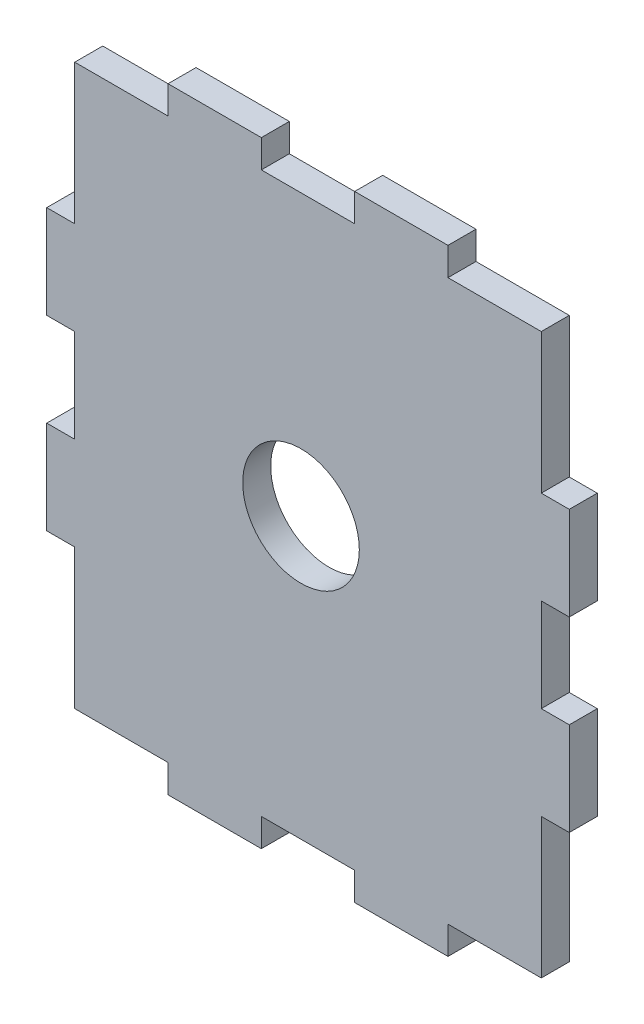
ISO-10303-21;
HEADER;
FILE_DESCRIPTION(('STEP AP214'),'2;1');
FILE_NAME('part.step','',(''),(''),'','','');
FILE_SCHEMA(('AUTOMOTIVE_DESIGN { 1 0 10303 214 1 1 1 1 }'));
ENDSEC;
DATA;
#1=APPLICATION_CONTEXT('core data for automotive mechanical design processes');
#2=APPLICATION_PROTOCOL_DEFINITION('international standard','automotive_design',2000,#1);
#3=PRODUCT_CONTEXT('',#1,'mechanical');
#4=PRODUCT('Part','Part','',(#3));
#5=PRODUCT_RELATED_PRODUCT_CATEGORY('part','',(#4));
#6=PRODUCT_DEFINITION_FORMATION('','',#4);
#7=PRODUCT_DEFINITION_CONTEXT('part definition',#1,'design');
#8=PRODUCT_DEFINITION('design','',#6,#7);
#9=PRODUCT_DEFINITION_SHAPE('','',#8);
#10=(LENGTH_UNIT() NAMED_UNIT(*) SI_UNIT(.MILLI.,.METRE.));
#11=(NAMED_UNIT(*) PLANE_ANGLE_UNIT() SI_UNIT($,.RADIAN.));
#12=(NAMED_UNIT(*) SI_UNIT($,.STERADIAN.) SOLID_ANGLE_UNIT());
#13=UNCERTAINTY_MEASURE_WITH_UNIT(LENGTH_MEASURE(1.E-05),#10,'distance_accuracy_value','');
#14=(GEOMETRIC_REPRESENTATION_CONTEXT(3) GLOBAL_UNCERTAINTY_ASSIGNED_CONTEXT((#13)) GLOBAL_UNIT_ASSIGNED_CONTEXT((#10,
#11,#12)) REPRESENTATION_CONTEXT('',''));
#15=CARTESIAN_POINT('',(0.,0.,0.));
#16=DIRECTION('',(0.,0.,1.));
#17=DIRECTION('',(1.,0.,0.));
#18=AXIS2_PLACEMENT_3D('',#15,#16,#17);
#19=CARTESIAN_POINT('',(0.,0.,6.));
#20=DIRECTION('',(0.,0.,-1.));
#21=DIRECTION('',(-1.,0.,0.));
#22=AXIS2_PLACEMENT_3D('',#19,#20,#21);
#23=PLANE('',#22);
#24=DIRECTION('',(0.,-1.,0.));
#25=VECTOR('',#24,1.);
#26=CARTESIAN_POINT('',(-40.,-30.,6.));
#27=LINE('',#26,#25);
#28=CARTESIAN_POINT('',(-40.,0.,6.));
#29=VERTEX_POINT('',#28);
#30=CARTESIAN_POINT('',(-40.,-30.,6.));
#31=VERTEX_POINT('',#30);
#32=EDGE_CURVE('E369',#29,#31,#27,.T.);
#33=ORIENTED_EDGE('',*,*,#32,.T.);
#34=DIRECTION('',(-1.,0.,0.));
#35=VECTOR('',#34,1.);
#36=CARTESIAN_POINT('',(-46.,-30.,6.));
#37=LINE('',#36,#35);
#38=CARTESIAN_POINT('',(-46.,-30.,6.));
#39=VERTEX_POINT('',#38);
#40=EDGE_CURVE('E177',#31,#39,#37,.T.);
#41=ORIENTED_EDGE('',*,*,#40,.T.);
#42=DIRECTION('',(0.,-1.,0.));
#43=VECTOR('',#42,1.);
#44=CARTESIAN_POINT('',(-46.,-50.,6.));
#45=LINE('',#44,#43);
#46=CARTESIAN_POINT('',(-46.,-50.,6.));
#47=VERTEX_POINT('',#46);
#48=EDGE_CURVE('E468',#39,#47,#45,.T.);
#49=ORIENTED_EDGE('',*,*,#48,.T.);
#50=DIRECTION('',(1.,0.,0.));
#51=VECTOR('',#50,1.);
#52=CARTESIAN_POINT('',(-40.,-50.,6.));
#53=LINE('',#52,#51);
#54=CARTESIAN_POINT('',(-40.,-50.,6.));
#55=VERTEX_POINT('',#54);
#56=EDGE_CURVE('E487',#47,#55,#53,.T.);
#57=ORIENTED_EDGE('',*,*,#56,.T.);
#58=DIRECTION('',(0.,-1.,0.));
#59=VECTOR('',#58,1.);
#60=CARTESIAN_POINT('',(-40.,-70.,6.));
#61=LINE('',#60,#59);
#62=CARTESIAN_POINT('',(-40.,-70.,6.));
#63=VERTEX_POINT('',#62);
#64=EDGE_CURVE('E484',#55,#63,#61,.T.);
#65=ORIENTED_EDGE('',*,*,#64,.T.);
#66=DIRECTION('',(-1.,0.,0.));
#67=VECTOR('',#66,1.);
#68=CARTESIAN_POINT('',(-46.,-70.,6.));
#69=LINE('',#68,#67);
#70=CARTESIAN_POINT('',(-46.,-70.,6.));
#71=VERTEX_POINT('',#70);
#72=EDGE_CURVE('E486',#63,#71,#69,.T.);
#73=ORIENTED_EDGE('',*,*,#72,.T.);
#74=DIRECTION('',(0.,-1.,0.));
#75=VECTOR('',#74,1.);
#76=CARTESIAN_POINT('',(-46.,-90.,6.));
#77=LINE('',#76,#75);
#78=CARTESIAN_POINT('',(-46.,-90.,6.));
#79=VERTEX_POINT('',#78);
#80=EDGE_CURVE('E489',#71,#79,#77,.T.);
#81=ORIENTED_EDGE('',*,*,#80,.T.);
#82=DIRECTION('',(1.,0.,0.));
#83=VECTOR('',#82,1.);
#84=CARTESIAN_POINT('',(-40.,-90.,6.));
#85=LINE('',#84,#83);
#86=CARTESIAN_POINT('',(-40.,-90.,6.));
#87=VERTEX_POINT('',#86);
#88=EDGE_CURVE('E495',#79,#87,#85,.T.);
#89=ORIENTED_EDGE('',*,*,#88,.T.);
#90=DIRECTION('',(0.,-1.,0.));
#91=VECTOR('',#90,1.);
#92=CARTESIAN_POINT('',(-40.,-120.,6.));
#93=LINE('',#92,#91);
#94=CARTESIAN_POINT('',(-40.,-120.,6.));
#95=VERTEX_POINT('',#94);
#96=EDGE_CURVE('E497',#87,#95,#93,.T.);
#97=ORIENTED_EDGE('',*,*,#96,.T.);
#98=DIRECTION('',(1.,0.,0.));
#99=VECTOR('',#98,1.);
#100=CARTESIAN_POINT('',(-20.,-120.,6.));
#101=LINE('',#100,#99);
#102=CARTESIAN_POINT('',(-20.,-120.,6.));
#103=VERTEX_POINT('',#102);
#104=EDGE_CURVE('E499',#95,#103,#101,.T.);
#105=ORIENTED_EDGE('',*,*,#104,.T.);
#106=DIRECTION('',(0.,-1.,0.));
#107=VECTOR('',#106,1.);
#108=CARTESIAN_POINT('',(-20.,-126.,6.));
#109=LINE('',#108,#107);
#110=CARTESIAN_POINT('',(-20.,-126.,6.));
#111=VERTEX_POINT('',#110);
#112=EDGE_CURVE('E501',#103,#111,#109,.T.);
#113=ORIENTED_EDGE('',*,*,#112,.T.);
#114=DIRECTION('',(1.,0.,0.));
#115=VECTOR('',#114,1.);
#116=CARTESIAN_POINT('',(0.,-126.,6.));
#117=LINE('',#116,#115);
#118=CARTESIAN_POINT('',(0.,-126.,6.));
#119=VERTEX_POINT('',#118);
#120=EDGE_CURVE('E503',#111,#119,#117,.T.);
#121=ORIENTED_EDGE('',*,*,#120,.T.);
#122=DIRECTION('',(0.,1.,0.));
#123=VECTOR('',#122,1.);
#124=CARTESIAN_POINT('',(0.,-120.,6.));
#125=LINE('',#124,#123);
#126=CARTESIAN_POINT('',(0.,-120.,6.));
#127=VERTEX_POINT('',#126);
#128=EDGE_CURVE('E505',#119,#127,#125,.T.);
#129=ORIENTED_EDGE('',*,*,#128,.T.);
#130=DIRECTION('',(1.,0.,0.));
#131=VECTOR('',#130,1.);
#132=CARTESIAN_POINT('',(20.,-120.,6.));
#133=LINE('',#132,#131);
#134=CARTESIAN_POINT('',(20.,-120.,6.));
#135=VERTEX_POINT('',#134);
#136=EDGE_CURVE('E507',#127,#135,#133,.T.);
#137=ORIENTED_EDGE('',*,*,#136,.T.);
#138=DIRECTION('',(0.,-1.,0.));
#139=VECTOR('',#138,1.);
#140=CARTESIAN_POINT('',(20.,-126.,6.));
#141=LINE('',#140,#139);
#142=CARTESIAN_POINT('',(20.,-126.,6.));
#143=VERTEX_POINT('',#142);
#144=EDGE_CURVE('E509',#135,#143,#141,.T.);
#145=ORIENTED_EDGE('',*,*,#144,.T.);
#146=DIRECTION('',(1.,0.,0.));
#147=VECTOR('',#146,1.);
#148=CARTESIAN_POINT('',(40.,-126.,6.));
#149=LINE('',#148,#147);
#150=CARTESIAN_POINT('',(40.,-126.,6.));
#151=VERTEX_POINT('',#150);
#152=EDGE_CURVE('E511',#143,#151,#149,.T.);
#153=ORIENTED_EDGE('',*,*,#152,.T.);
#154=DIRECTION('',(0.,1.,0.));
#155=VECTOR('',#154,1.);
#156=CARTESIAN_POINT('',(40.,-120.,6.));
#157=LINE('',#156,#155);
#158=CARTESIAN_POINT('',(40.,-120.,6.));
#159=VERTEX_POINT('',#158);
#160=EDGE_CURVE('E513',#151,#159,#157,.T.);
#161=ORIENTED_EDGE('',*,*,#160,.T.);
#162=DIRECTION('',(1.,0.,0.));
#163=VECTOR('',#162,1.);
#164=CARTESIAN_POINT('',(60.,-120.,6.));
#165=LINE('',#164,#163);
#166=CARTESIAN_POINT('',(60.,-120.,6.));
#167=VERTEX_POINT('',#166);
#168=EDGE_CURVE('E515',#159,#167,#165,.T.);
#169=ORIENTED_EDGE('',*,*,#168,.T.);
#170=DIRECTION('',(0.,1.,0.));
#171=VECTOR('',#170,1.);
#172=CARTESIAN_POINT('',(60.,-90.,6.));
#173=LINE('',#172,#171);
#174=CARTESIAN_POINT('',(60.,-90.,6.));
#175=VERTEX_POINT('',#174);
#176=EDGE_CURVE('E517',#167,#175,#173,.T.);
#177=ORIENTED_EDGE('',*,*,#176,.T.);
#178=DIRECTION('',(1.,0.,0.));
#179=VECTOR('',#178,1.);
#180=CARTESIAN_POINT('',(66.,-90.,6.));
#181=LINE('',#180,#179);
#182=CARTESIAN_POINT('',(66.,-90.,6.));
#183=VERTEX_POINT('',#182);
#184=EDGE_CURVE('E519',#175,#183,#181,.T.);
#185=ORIENTED_EDGE('',*,*,#184,.T.);
#186=DIRECTION('',(0.,1.,0.));
#187=VECTOR('',#186,1.);
#188=CARTESIAN_POINT('',(66.,-70.,6.));
#189=LINE('',#188,#187);
#190=CARTESIAN_POINT('',(66.,-70.,6.));
#191=VERTEX_POINT('',#190);
#192=EDGE_CURVE('E521',#183,#191,#189,.T.);
#193=ORIENTED_EDGE('',*,*,#192,.T.);
#194=DIRECTION('',(-1.,0.,0.));
#195=VECTOR('',#194,1.);
#196=CARTESIAN_POINT('',(60.,-70.,6.));
#197=LINE('',#196,#195);
#198=CARTESIAN_POINT('',(60.,-70.,6.));
#199=VERTEX_POINT('',#198);
#200=EDGE_CURVE('E523',#191,#199,#197,.T.);
#201=ORIENTED_EDGE('',*,*,#200,.T.);
#202=DIRECTION('',(0.,1.,0.));
#203=VECTOR('',#202,1.);
#204=CARTESIAN_POINT('',(60.,-50.,6.));
#205=LINE('',#204,#203);
#206=CARTESIAN_POINT('',(60.,-50.,6.));
#207=VERTEX_POINT('',#206);
#208=EDGE_CURVE('E525',#199,#207,#205,.T.);
#209=ORIENTED_EDGE('',*,*,#208,.T.);
#210=DIRECTION('',(1.,0.,0.));
#211=VECTOR('',#210,1.);
#212=CARTESIAN_POINT('',(66.,-50.,6.));
#213=LINE('',#212,#211);
#214=CARTESIAN_POINT('',(66.,-50.,6.));
#215=VERTEX_POINT('',#214);
#216=EDGE_CURVE('E527',#207,#215,#213,.T.);
#217=ORIENTED_EDGE('',*,*,#216,.T.);
#218=DIRECTION('',(0.,1.,0.));
#219=VECTOR('',#218,1.);
#220=CARTESIAN_POINT('',(66.,-30.,6.));
#221=LINE('',#220,#219);
#222=CARTESIAN_POINT('',(66.,-30.,6.));
#223=VERTEX_POINT('',#222);
#224=EDGE_CURVE('E529',#215,#223,#221,.T.);
#225=ORIENTED_EDGE('',*,*,#224,.T.);
#226=DIRECTION('',(-1.,0.,0.));
#227=VECTOR('',#226,1.);
#228=CARTESIAN_POINT('',(60.,-30.,6.));
#229=LINE('',#228,#227);
#230=CARTESIAN_POINT('',(60.,-30.,6.));
#231=VERTEX_POINT('',#230);
#232=EDGE_CURVE('E531',#223,#231,#229,.T.);
#233=ORIENTED_EDGE('',*,*,#232,.T.);
#234=DIRECTION('',(0.,1.,0.));
#235=VECTOR('',#234,1.);
#236=CARTESIAN_POINT('',(60.,0.,6.));
#237=LINE('',#236,#235);
#238=CARTESIAN_POINT('',(60.,0.,6.));
#239=VERTEX_POINT('',#238);
#240=EDGE_CURVE('E533',#231,#239,#237,.T.);
#241=ORIENTED_EDGE('',*,*,#240,.T.);
#242=DIRECTION('',(-1.,0.,0.));
#243=VECTOR('',#242,1.);
#244=CARTESIAN_POINT('',(40.,0.,6.));
#245=LINE('',#244,#243);
#246=CARTESIAN_POINT('',(40.,0.,6.));
#247=VERTEX_POINT('',#246);
#248=EDGE_CURVE('E535',#239,#247,#245,.T.);
#249=ORIENTED_EDGE('',*,*,#248,.T.);
#250=DIRECTION('',(0.,1.,0.));
#251=VECTOR('',#250,1.);
#252=CARTESIAN_POINT('',(40.,6.,6.));
#253=LINE('',#252,#251);
#254=CARTESIAN_POINT('',(40.,6.,6.));
#255=VERTEX_POINT('',#254);
#256=EDGE_CURVE('E537',#247,#255,#253,.T.);
#257=ORIENTED_EDGE('',*,*,#256,.T.);
#258=DIRECTION('',(-1.,0.,0.));
#259=VECTOR('',#258,1.);
#260=CARTESIAN_POINT('',(20.,6.,6.));
#261=LINE('',#260,#259);
#262=CARTESIAN_POINT('',(20.,6.,6.));
#263=VERTEX_POINT('',#262);
#264=EDGE_CURVE('E539',#255,#263,#261,.T.);
#265=ORIENTED_EDGE('',*,*,#264,.T.);
#266=DIRECTION('',(0.,-1.,0.));
#267=VECTOR('',#266,1.);
#268=CARTESIAN_POINT('',(20.,0.,6.));
#269=LINE('',#268,#267);
#270=CARTESIAN_POINT('',(20.,0.,6.));
#271=VERTEX_POINT('',#270);
#272=EDGE_CURVE('E541',#263,#271,#269,.T.);
#273=ORIENTED_EDGE('',*,*,#272,.T.);
#274=DIRECTION('',(-1.,0.,0.));
#275=VECTOR('',#274,1.);
#276=CARTESIAN_POINT('',(0.,0.,6.));
#277=LINE('',#276,#275);
#278=CARTESIAN_POINT('',(0.,0.,6.));
#279=VERTEX_POINT('',#278);
#280=EDGE_CURVE('E543',#271,#279,#277,.T.);
#281=ORIENTED_EDGE('',*,*,#280,.T.);
#282=DIRECTION('',(0.,1.,0.));
#283=VECTOR('',#282,1.);
#284=CARTESIAN_POINT('',(0.,6.,6.));
#285=LINE('',#284,#283);
#286=CARTESIAN_POINT('',(0.,6.,6.));
#287=VERTEX_POINT('',#286);
#288=EDGE_CURVE('E280',#279,#287,#285,.T.);
#289=ORIENTED_EDGE('',*,*,#288,.T.);
#290=DIRECTION('',(-1.,0.,0.));
#291=VECTOR('',#290,1.);
#292=CARTESIAN_POINT('',(-20.,6.,6.));
#293=LINE('',#292,#291);
#294=CARTESIAN_POINT('',(-20.,6.,6.));
#295=VERTEX_POINT('',#294);
#296=EDGE_CURVE('E274',#287,#295,#293,.T.);
#297=ORIENTED_EDGE('',*,*,#296,.T.);
#298=DIRECTION('',(0.,-1.,0.));
#299=VECTOR('',#298,1.);
#300=CARTESIAN_POINT('',(-20.,0.,6.));
#301=LINE('',#300,#299);
#302=CARTESIAN_POINT('',(-20.,0.,6.));
#303=VERTEX_POINT('',#302);
#304=EDGE_CURVE('E278',#295,#303,#301,.T.);
#305=ORIENTED_EDGE('',*,*,#304,.T.);
#306=DIRECTION('',(-1.,0.,0.));
#307=VECTOR('',#306,1.);
#308=CARTESIAN_POINT('',(-40.,0.,6.));
#309=LINE('',#308,#307);
#310=EDGE_CURVE('E50',#303,#29,#309,.T.);
#311=ORIENTED_EDGE('',*,*,#310,.T.);
#312=EDGE_LOOP('',(#33,#41,#49,#57,#65,#73,#81,#89,#97,#105,#113,#121,#129,#137,#145,#153,#161,
#169,#177,#185,#193,#201,#209,#217,#225,#233,#241,#249,#257,#265,#273,#281,#289,#297,#305,#311));
#313=FACE_BOUND('',#312,.T.);
#314=CARTESIAN_POINT('',(8.49999999999999,-60.,6.));
#315=DIRECTION('',(0.,0.,1.));
#316=DIRECTION('',(1.,0.,0.));
#317=AXIS2_PLACEMENT_3D('',#314,#315,#316);
#318=CIRCLE('',#317,12.5);
#319=CARTESIAN_POINT('',(21.,-60.,6.));
#320=VERTEX_POINT('',#319);
#321=EDGE_CURVE('E302',#320,#320,#318,.T.);
#322=ORIENTED_EDGE('',*,*,#321,.F.);
#323=EDGE_LOOP('',(#322));
#324=FACE_BOUND('',#323,.T.);
#325=ADVANCED_FACE('F33',(#313,#324),#23,.F.);
#326=CARTESIAN_POINT('',(0.,0.,0.));
#327=DIRECTION('',(0.,0.,-1.));
#328=DIRECTION('',(-1.,0.,0.));
#329=AXIS2_PLACEMENT_3D('',#326,#327,#328);
#330=PLANE('',#329);
#331=DIRECTION('',(0.,-1.,0.));
#332=VECTOR('',#331,1.);
#333=CARTESIAN_POINT('',(-40.,-30.,0.));
#334=LINE('',#333,#332);
#335=CARTESIAN_POINT('',(-40.,0.,0.));
#336=VERTEX_POINT('',#335);
#337=CARTESIAN_POINT('',(-40.,-30.,0.));
#338=VERTEX_POINT('',#337);
#339=EDGE_CURVE('E298',#336,#338,#334,.T.);
#340=ORIENTED_EDGE('',*,*,#339,.F.);
#341=DIRECTION('',(-1.,0.,0.));
#342=VECTOR('',#341,1.);
#343=CARTESIAN_POINT('',(-40.,0.,0.));
#344=LINE('',#343,#342);
#345=CARTESIAN_POINT('',(-20.,0.,0.));
#346=VERTEX_POINT('',#345);
#347=EDGE_CURVE('E169',#346,#336,#344,.T.);
#348=ORIENTED_EDGE('',*,*,#347,.F.);
#349=DIRECTION('',(0.,-1.,0.));
#350=VECTOR('',#349,1.);
#351=CARTESIAN_POINT('',(-20.,0.,0.));
#352=LINE('',#351,#350);
#353=CARTESIAN_POINT('',(-20.,6.,0.));
#354=VERTEX_POINT('',#353);
#355=EDGE_CURVE('E163',#354,#346,#352,.T.);
#356=ORIENTED_EDGE('',*,*,#355,.F.);
#357=DIRECTION('',(-1.,0.,0.));
#358=VECTOR('',#357,1.);
#359=CARTESIAN_POINT('',(-20.,6.,0.));
#360=LINE('',#359,#358);
#361=CARTESIAN_POINT('',(0.,6.,0.));
#362=VERTEX_POINT('',#361);
#363=EDGE_CURVE('E288',#362,#354,#360,.T.);
#364=ORIENTED_EDGE('',*,*,#363,.F.);
#365=DIRECTION('',(0.,1.,0.));
#366=VECTOR('',#365,1.);
#367=CARTESIAN_POINT('',(0.,6.,0.));
#368=LINE('',#367,#366);
#369=CARTESIAN_POINT('',(0.,0.,0.));
#370=VERTEX_POINT('',#369);
#371=EDGE_CURVE('E364',#370,#362,#368,.T.);
#372=ORIENTED_EDGE('',*,*,#371,.F.);
#373=DIRECTION('',(-1.,0.,0.));
#374=VECTOR('',#373,1.);
#375=CARTESIAN_POINT('',(0.,0.,0.));
#376=LINE('',#375,#374);
#377=CARTESIAN_POINT('',(20.,0.,0.));
#378=VERTEX_POINT('',#377);
#379=EDGE_CURVE('E362',#378,#370,#376,.T.);
#380=ORIENTED_EDGE('',*,*,#379,.F.);
#381=DIRECTION('',(0.,-1.,0.));
#382=VECTOR('',#381,1.);
#383=CARTESIAN_POINT('',(20.,0.,0.));
#384=LINE('',#383,#382);
#385=CARTESIAN_POINT('',(20.,6.,0.));
#386=VERTEX_POINT('',#385);
#387=EDGE_CURVE('E360',#386,#378,#384,.T.);
#388=ORIENTED_EDGE('',*,*,#387,.F.);
#389=DIRECTION('',(-1.,0.,0.));
#390=VECTOR('',#389,1.);
#391=CARTESIAN_POINT('',(20.,6.,0.));
#392=LINE('',#391,#390);
#393=CARTESIAN_POINT('',(40.,6.,0.));
#394=VERTEX_POINT('',#393);
#395=EDGE_CURVE('E358',#394,#386,#392,.T.);
#396=ORIENTED_EDGE('',*,*,#395,.F.);
#397=DIRECTION('',(0.,1.,0.));
#398=VECTOR('',#397,1.);
#399=CARTESIAN_POINT('',(40.,6.,0.));
#400=LINE('',#399,#398);
#401=CARTESIAN_POINT('',(40.,0.,0.));
#402=VERTEX_POINT('',#401);
#403=EDGE_CURVE('E356',#402,#394,#400,.T.);
#404=ORIENTED_EDGE('',*,*,#403,.F.);
#405=DIRECTION('',(-1.,0.,0.));
#406=VECTOR('',#405,1.);
#407=CARTESIAN_POINT('',(40.,0.,0.));
#408=LINE('',#407,#406);
#409=CARTESIAN_POINT('',(60.,0.,0.));
#410=VERTEX_POINT('',#409);
#411=EDGE_CURVE('E354',#410,#402,#408,.T.);
#412=ORIENTED_EDGE('',*,*,#411,.F.);
#413=DIRECTION('',(0.,1.,0.));
#414=VECTOR('',#413,1.);
#415=CARTESIAN_POINT('',(60.,0.,0.));
#416=LINE('',#415,#414);
#417=CARTESIAN_POINT('',(60.,-30.,0.));
#418=VERTEX_POINT('',#417);
#419=EDGE_CURVE('E352',#418,#410,#416,.T.);
#420=ORIENTED_EDGE('',*,*,#419,.F.);
#421=DIRECTION('',(-1.,0.,0.));
#422=VECTOR('',#421,1.);
#423=CARTESIAN_POINT('',(60.,-30.,0.));
#424=LINE('',#423,#422);
#425=CARTESIAN_POINT('',(66.,-30.,0.));
#426=VERTEX_POINT('',#425);
#427=EDGE_CURVE('E350',#426,#418,#424,.T.);
#428=ORIENTED_EDGE('',*,*,#427,.F.);
#429=DIRECTION('',(0.,1.,0.));
#430=VECTOR('',#429,1.);
#431=CARTESIAN_POINT('',(66.,-30.,0.));
#432=LINE('',#431,#430);
#433=CARTESIAN_POINT('',(66.,-50.,0.));
#434=VERTEX_POINT('',#433);
#435=EDGE_CURVE('E348',#434,#426,#432,.T.);
#436=ORIENTED_EDGE('',*,*,#435,.F.);
#437=DIRECTION('',(1.,0.,0.));
#438=VECTOR('',#437,1.);
#439=CARTESIAN_POINT('',(66.,-50.,0.));
#440=LINE('',#439,#438);
#441=CARTESIAN_POINT('',(60.,-50.,0.));
#442=VERTEX_POINT('',#441);
#443=EDGE_CURVE('E346',#442,#434,#440,.T.);
#444=ORIENTED_EDGE('',*,*,#443,.F.);
#445=DIRECTION('',(0.,1.,0.));
#446=VECTOR('',#445,1.);
#447=CARTESIAN_POINT('',(60.,-50.,0.));
#448=LINE('',#447,#446);
#449=CARTESIAN_POINT('',(60.,-70.,0.));
#450=VERTEX_POINT('',#449);
#451=EDGE_CURVE('E344',#450,#442,#448,.T.);
#452=ORIENTED_EDGE('',*,*,#451,.F.);
#453=DIRECTION('',(-1.,0.,0.));
#454=VECTOR('',#453,1.);
#455=CARTESIAN_POINT('',(60.,-70.,0.));
#456=LINE('',#455,#454);
#457=CARTESIAN_POINT('',(66.,-70.,0.));
#458=VERTEX_POINT('',#457);
#459=EDGE_CURVE('E342',#458,#450,#456,.T.);
#460=ORIENTED_EDGE('',*,*,#459,.F.);
#461=DIRECTION('',(0.,1.,0.));
#462=VECTOR('',#461,1.);
#463=CARTESIAN_POINT('',(66.,-70.,0.));
#464=LINE('',#463,#462);
#465=CARTESIAN_POINT('',(66.,-90.,0.));
#466=VERTEX_POINT('',#465);
#467=EDGE_CURVE('E340',#466,#458,#464,.T.);
#468=ORIENTED_EDGE('',*,*,#467,.F.);
#469=DIRECTION('',(1.,0.,0.));
#470=VECTOR('',#469,1.);
#471=CARTESIAN_POINT('',(66.,-90.,0.));
#472=LINE('',#471,#470);
#473=CARTESIAN_POINT('',(60.,-90.,0.));
#474=VERTEX_POINT('',#473);
#475=EDGE_CURVE('E338',#474,#466,#472,.T.);
#476=ORIENTED_EDGE('',*,*,#475,.F.);
#477=DIRECTION('',(0.,1.,0.));
#478=VECTOR('',#477,1.);
#479=CARTESIAN_POINT('',(60.,-90.,0.));
#480=LINE('',#479,#478);
#481=CARTESIAN_POINT('',(60.,-120.,0.));
#482=VERTEX_POINT('',#481);
#483=EDGE_CURVE('E336',#482,#474,#480,.T.);
#484=ORIENTED_EDGE('',*,*,#483,.F.);
#485=DIRECTION('',(1.,0.,0.));
#486=VECTOR('',#485,1.);
#487=CARTESIAN_POINT('',(60.,-120.,0.));
#488=LINE('',#487,#486);
#489=CARTESIAN_POINT('',(40.,-120.,0.));
#490=VERTEX_POINT('',#489);
#491=EDGE_CURVE('E334',#490,#482,#488,.T.);
#492=ORIENTED_EDGE('',*,*,#491,.F.);
#493=DIRECTION('',(0.,1.,0.));
#494=VECTOR('',#493,1.);
#495=CARTESIAN_POINT('',(40.,-120.,0.));
#496=LINE('',#495,#494);
#497=CARTESIAN_POINT('',(40.,-126.,0.));
#498=VERTEX_POINT('',#497);
#499=EDGE_CURVE('E332',#498,#490,#496,.T.);
#500=ORIENTED_EDGE('',*,*,#499,.F.);
#501=DIRECTION('',(1.,0.,0.));
#502=VECTOR('',#501,1.);
#503=CARTESIAN_POINT('',(40.,-126.,0.));
#504=LINE('',#503,#502);
#505=CARTESIAN_POINT('',(20.,-126.,0.));
#506=VERTEX_POINT('',#505);
#507=EDGE_CURVE('E330',#506,#498,#504,.T.);
#508=ORIENTED_EDGE('',*,*,#507,.F.);
#509=DIRECTION('',(0.,-1.,0.));
#510=VECTOR('',#509,1.);
#511=CARTESIAN_POINT('',(20.,-126.,0.));
#512=LINE('',#511,#510);
#513=CARTESIAN_POINT('',(20.,-120.,0.));
#514=VERTEX_POINT('',#513);
#515=EDGE_CURVE('E328',#514,#506,#512,.T.);
#516=ORIENTED_EDGE('',*,*,#515,.F.);
#517=DIRECTION('',(1.,0.,0.));
#518=VECTOR('',#517,1.);
#519=CARTESIAN_POINT('',(20.,-120.,0.));
#520=LINE('',#519,#518);
#521=CARTESIAN_POINT('',(0.,-120.,0.));
#522=VERTEX_POINT('',#521);
#523=EDGE_CURVE('E326',#522,#514,#520,.T.);
#524=ORIENTED_EDGE('',*,*,#523,.F.);
#525=DIRECTION('',(0.,1.,0.));
#526=VECTOR('',#525,1.);
#527=CARTESIAN_POINT('',(0.,-120.,0.));
#528=LINE('',#527,#526);
#529=CARTESIAN_POINT('',(0.,-126.,0.));
#530=VERTEX_POINT('',#529);
#531=EDGE_CURVE('E324',#530,#522,#528,.T.);
#532=ORIENTED_EDGE('',*,*,#531,.F.);
#533=DIRECTION('',(1.,0.,0.));
#534=VECTOR('',#533,1.);
#535=CARTESIAN_POINT('',(0.,-126.,0.));
#536=LINE('',#535,#534);
#537=CARTESIAN_POINT('',(-20.,-126.,0.));
#538=VERTEX_POINT('',#537);
#539=EDGE_CURVE('E322',#538,#530,#536,.T.);
#540=ORIENTED_EDGE('',*,*,#539,.F.);
#541=DIRECTION('',(0.,-1.,0.));
#542=VECTOR('',#541,1.);
#543=CARTESIAN_POINT('',(-20.,-126.,0.));
#544=LINE('',#543,#542);
#545=CARTESIAN_POINT('',(-20.,-120.,0.));
#546=VERTEX_POINT('',#545);
#547=EDGE_CURVE('E320',#546,#538,#544,.T.);
#548=ORIENTED_EDGE('',*,*,#547,.F.);
#549=DIRECTION('',(1.,0.,0.));
#550=VECTOR('',#549,1.);
#551=CARTESIAN_POINT('',(-20.,-120.,0.));
#552=LINE('',#551,#550);
#553=CARTESIAN_POINT('',(-40.,-120.,0.));
#554=VERTEX_POINT('',#553);
#555=EDGE_CURVE('E318',#554,#546,#552,.T.);
#556=ORIENTED_EDGE('',*,*,#555,.F.);
#557=DIRECTION('',(0.,-1.,0.));
#558=VECTOR('',#557,1.);
#559=CARTESIAN_POINT('',(-40.,-120.,0.));
#560=LINE('',#559,#558);
#561=CARTESIAN_POINT('',(-40.,-90.,0.));
#562=VERTEX_POINT('',#561);
#563=EDGE_CURVE('E316',#562,#554,#560,.T.);
#564=ORIENTED_EDGE('',*,*,#563,.F.);
#565=DIRECTION('',(1.,0.,0.));
#566=VECTOR('',#565,1.);
#567=CARTESIAN_POINT('',(-40.,-90.,0.));
#568=LINE('',#567,#566);
#569=CARTESIAN_POINT('',(-46.,-90.,0.));
#570=VERTEX_POINT('',#569);
#571=EDGE_CURVE('E314',#570,#562,#568,.T.);
#572=ORIENTED_EDGE('',*,*,#571,.F.);
#573=DIRECTION('',(0.,-1.,0.));
#574=VECTOR('',#573,1.);
#575=CARTESIAN_POINT('',(-46.,-90.,0.));
#576=LINE('',#575,#574);
#577=CARTESIAN_POINT('',(-46.,-70.,0.));
#578=VERTEX_POINT('',#577);
#579=EDGE_CURVE('E312',#578,#570,#576,.T.);
#580=ORIENTED_EDGE('',*,*,#579,.F.);
#581=DIRECTION('',(-1.,0.,0.));
#582=VECTOR('',#581,1.);
#583=CARTESIAN_POINT('',(-46.,-70.,0.));
#584=LINE('',#583,#582);
#585=CARTESIAN_POINT('',(-40.,-70.,0.));
#586=VERTEX_POINT('',#585);
#587=EDGE_CURVE('E310',#586,#578,#584,.T.);
#588=ORIENTED_EDGE('',*,*,#587,.F.);
#589=DIRECTION('',(0.,-1.,0.));
#590=VECTOR('',#589,1.);
#591=CARTESIAN_POINT('',(-40.,-70.,0.));
#592=LINE('',#591,#590);
#593=CARTESIAN_POINT('',(-40.,-50.,0.));
#594=VERTEX_POINT('',#593);
#595=EDGE_CURVE('E308',#594,#586,#592,.T.);
#596=ORIENTED_EDGE('',*,*,#595,.F.);
#597=DIRECTION('',(1.,0.,0.));
#598=VECTOR('',#597,1.);
#599=CARTESIAN_POINT('',(-40.,-50.,0.));
#600=LINE('',#599,#598);
#601=CARTESIAN_POINT('',(-46.,-50.,0.));
#602=VERTEX_POINT('',#601);
#603=EDGE_CURVE('E306',#602,#594,#600,.T.);
#604=ORIENTED_EDGE('',*,*,#603,.F.);
#605=DIRECTION('',(0.,-1.,0.));
#606=VECTOR('',#605,1.);
#607=CARTESIAN_POINT('',(-46.,-50.,0.));
#608=LINE('',#607,#606);
#609=CARTESIAN_POINT('',(-46.,-30.,0.));
#610=VERTEX_POINT('',#609);
#611=EDGE_CURVE('E304',#610,#602,#608,.T.);
#612=ORIENTED_EDGE('',*,*,#611,.F.);
#613=DIRECTION('',(-1.,0.,0.));
#614=VECTOR('',#613,1.);
#615=CARTESIAN_POINT('',(-46.,-30.,0.));
#616=LINE('',#615,#614);
#617=EDGE_CURVE('E301',#338,#610,#616,.T.);
#618=ORIENTED_EDGE('',*,*,#617,.F.);
#619=EDGE_LOOP('',(#340,#348,#356,#364,#372,#380,#388,#396,#404,#412,#420,#428,#436,#444,#452,
#460,#468,#476,#484,#492,#500,#508,#516,#524,#532,#540,#548,#556,#564,#572,#580,#588,#596,#604,
#612,#618));
#620=FACE_BOUND('',#619,.T.);
#621=CARTESIAN_POINT('',(8.49999999999999,-60.,0.));
#622=DIRECTION('',(0.,0.,1.));
#623=DIRECTION('',(1.,0.,0.));
#624=AXIS2_PLACEMENT_3D('',#621,#622,#623);
#625=CIRCLE('',#624,12.5);
#626=CARTESIAN_POINT('',(21.,-60.,0.));
#627=VERTEX_POINT('',#626);
#628=EDGE_CURVE('E1002',#627,#627,#625,.T.);
#629=ORIENTED_EDGE('',*,*,#628,.T.);
#630=EDGE_LOOP('',(#629));
#631=FACE_BOUND('',#630,.T.);
#632=ADVANCED_FACE('F472',(#620,#631),#330,.T.);
#633=CARTESIAN_POINT('',(-40.,-30.,6.));
#634=DIRECTION('',(1.,0.,0.));
#635=DIRECTION('',(0.,0.,-1.));
#636=AXIS2_PLACEMENT_3D('',#633,#634,#635);
#637=PLANE('',#636);
#638=ORIENTED_EDGE('',*,*,#339,.T.);
#639=DIRECTION('',(0.,0.,-1.));
#640=VECTOR('',#639,1.);
#641=CARTESIAN_POINT('',(-40.,-30.,6.));
#642=LINE('',#641,#640);
#643=EDGE_CURVE('E11',#31,#338,#642,.T.);
#644=ORIENTED_EDGE('',*,*,#643,.F.);
#645=ORIENTED_EDGE('',*,*,#32,.F.);
#646=DIRECTION('',(0.,0.,-1.));
#647=VECTOR('',#646,1.);
#648=CARTESIAN_POINT('',(-40.,0.,6.));
#649=LINE('',#648,#647);
#650=EDGE_CURVE('E294',#29,#336,#649,.T.);
#651=ORIENTED_EDGE('',*,*,#650,.T.);
#652=EDGE_LOOP('',(#638,#644,#645,#651));
#653=FACE_BOUND('',#652,.T.);
#654=ADVANCED_FACE('F35',(#653),#637,.F.);
#655=CARTESIAN_POINT('',(-46.,-30.,6.));
#656=DIRECTION('',(0.,-1.,0.));
#657=DIRECTION('',(0.,0.,-1.));
#658=AXIS2_PLACEMENT_3D('',#655,#656,#657);
#659=PLANE('',#658);
#660=ORIENTED_EDGE('',*,*,#617,.T.);
#661=DIRECTION('',(0.,0.,-1.));
#662=VECTOR('',#661,1.);
#663=CARTESIAN_POINT('',(-46.,-30.,6.));
#664=LINE('',#663,#662);
#665=EDGE_CURVE('E42',#39,#610,#664,.T.);
#666=ORIENTED_EDGE('',*,*,#665,.F.);
#667=ORIENTED_EDGE('',*,*,#40,.F.);
#668=ORIENTED_EDGE('',*,*,#643,.T.);
#669=EDGE_LOOP('',(#660,#666,#667,#668));
#670=FACE_BOUND('',#669,.T.);
#671=ADVANCED_FACE('F577',(#670),#659,.F.);
#672=CARTESIAN_POINT('',(-46.,-50.,6.));
#673=DIRECTION('',(1.,0.,0.));
#674=DIRECTION('',(0.,1.,0.));
#675=AXIS2_PLACEMENT_3D('',#672,#673,#674);
#676=PLANE('',#675);
#677=ORIENTED_EDGE('',*,*,#611,.T.);
#678=DIRECTION('',(0.,0.,-1.));
#679=VECTOR('',#678,1.);
#680=CARTESIAN_POINT('',(-46.,-50.,6.));
#681=LINE('',#680,#679);
#682=EDGE_CURVE('E460',#47,#602,#681,.T.);
#683=ORIENTED_EDGE('',*,*,#682,.F.);
#684=ORIENTED_EDGE('',*,*,#48,.F.);
#685=ORIENTED_EDGE('',*,*,#665,.T.);
#686=EDGE_LOOP('',(#677,#683,#684,#685));
#687=FACE_BOUND('',#686,.T.);
#688=ADVANCED_FACE('F466',(#687),#676,.F.);
#689=CARTESIAN_POINT('',(-40.,-50.,6.));
#690=DIRECTION('',(0.,1.,0.));
#691=DIRECTION('',(0.,0.,1.));
#692=AXIS2_PLACEMENT_3D('',#689,#690,#691);
#693=PLANE('',#692);
#694=ORIENTED_EDGE('',*,*,#603,.T.);
#695=DIRECTION('',(0.,0.,-1.));
#696=VECTOR('',#695,1.);
#697=CARTESIAN_POINT('',(-40.,-50.,6.));
#698=LINE('',#697,#696);
#699=EDGE_CURVE('E457',#55,#594,#698,.T.);
#700=ORIENTED_EDGE('',*,*,#699,.F.);
#701=ORIENTED_EDGE('',*,*,#56,.F.);
#702=ORIENTED_EDGE('',*,*,#682,.T.);
#703=EDGE_LOOP('',(#694,#700,#701,#702));
#704=FACE_BOUND('',#703,.T.);
#705=ADVANCED_FACE('F478',(#704),#693,.F.);
#706=CARTESIAN_POINT('',(-40.,-70.,6.));
#707=DIRECTION('',(1.,0.,0.));
#708=DIRECTION('',(0.,0.,-1.));
#709=AXIS2_PLACEMENT_3D('',#706,#707,#708);
#710=PLANE('',#709);
#711=ORIENTED_EDGE('',*,*,#595,.T.);
#712=DIRECTION('',(0.,0.,-1.));
#713=VECTOR('',#712,1.);
#714=CARTESIAN_POINT('',(-40.,-70.,6.));
#715=LINE('',#714,#713);
#716=EDGE_CURVE('E454',#63,#586,#715,.T.);
#717=ORIENTED_EDGE('',*,*,#716,.F.);
#718=ORIENTED_EDGE('',*,*,#64,.F.);
#719=ORIENTED_EDGE('',*,*,#699,.T.);
#720=EDGE_LOOP('',(#711,#717,#718,#719));
#721=FACE_BOUND('',#720,.T.);
#722=ADVANCED_FACE('F482',(#721),#710,.F.);
#723=CARTESIAN_POINT('',(-46.,-70.,6.));
#724=DIRECTION('',(0.,-1.,0.));
#725=DIRECTION('',(0.,0.,-1.));
#726=AXIS2_PLACEMENT_3D('',#723,#724,#725);
#727=PLANE('',#726);
#728=ORIENTED_EDGE('',*,*,#587,.T.);
#729=DIRECTION('',(0.,0.,-1.));
#730=VECTOR('',#729,1.);
#731=CARTESIAN_POINT('',(-46.,-70.,6.));
#732=LINE('',#731,#730);
#733=EDGE_CURVE('E451',#71,#578,#732,.T.);
#734=ORIENTED_EDGE('',*,*,#733,.F.);
#735=ORIENTED_EDGE('',*,*,#72,.F.);
#736=ORIENTED_EDGE('',*,*,#716,.T.);
#737=EDGE_LOOP('',(#728,#734,#735,#736));
#738=FACE_BOUND('',#737,.T.);
#739=ADVANCED_FACE('F590',(#738),#727,.F.);
#740=CARTESIAN_POINT('',(-46.,-90.,6.));
#741=DIRECTION('',(1.,0.,0.));
#742=DIRECTION('',(0.,1.,0.));
#743=AXIS2_PLACEMENT_3D('',#740,#741,#742);
#744=PLANE('',#743);
#745=ORIENTED_EDGE('',*,*,#579,.T.);
#746=DIRECTION('',(0.,0.,-1.));
#747=VECTOR('',#746,1.);
#748=CARTESIAN_POINT('',(-46.,-90.,6.));
#749=LINE('',#748,#747);
#750=EDGE_CURVE('E448',#79,#570,#749,.T.);
#751=ORIENTED_EDGE('',*,*,#750,.F.);
#752=ORIENTED_EDGE('',*,*,#80,.F.);
#753=ORIENTED_EDGE('',*,*,#733,.T.);
#754=EDGE_LOOP('',(#745,#751,#752,#753));
#755=FACE_BOUND('',#754,.T.);
#756=ADVANCED_FACE('F593',(#755),#744,.F.);
#757=CARTESIAN_POINT('',(-40.,-90.,6.));
#758=DIRECTION('',(0.,1.,0.));
#759=DIRECTION('',(0.,0.,1.));
#760=AXIS2_PLACEMENT_3D('',#757,#758,#759);
#761=PLANE('',#760);
#762=ORIENTED_EDGE('',*,*,#571,.T.);
#763=DIRECTION('',(0.,0.,-1.));
#764=VECTOR('',#763,1.);
#765=CARTESIAN_POINT('',(-40.,-90.,6.));
#766=LINE('',#765,#764);
#767=EDGE_CURVE('E445',#87,#562,#766,.T.);
#768=ORIENTED_EDGE('',*,*,#767,.F.);
#769=ORIENTED_EDGE('',*,*,#88,.F.);
#770=ORIENTED_EDGE('',*,*,#750,.T.);
#771=EDGE_LOOP('',(#762,#768,#769,#770));
#772=FACE_BOUND('',#771,.T.);
#773=ADVANCED_FACE('F597',(#772),#761,.F.);
#774=CARTESIAN_POINT('',(-40.,-120.,6.));
#775=DIRECTION('',(1.,0.,0.));
#776=DIRECTION('',(0.,1.,0.));
#777=AXIS2_PLACEMENT_3D('',#774,#775,#776);
#778=PLANE('',#777);
#779=ORIENTED_EDGE('',*,*,#563,.T.);
#780=DIRECTION('',(0.,0.,-1.));
#781=VECTOR('',#780,1.);
#782=CARTESIAN_POINT('',(-40.,-120.,6.));
#783=LINE('',#782,#781);
#784=EDGE_CURVE('E442',#95,#554,#783,.T.);
#785=ORIENTED_EDGE('',*,*,#784,.F.);
#786=ORIENTED_EDGE('',*,*,#96,.F.);
#787=ORIENTED_EDGE('',*,*,#767,.T.);
#788=EDGE_LOOP('',(#779,#785,#786,#787));
#789=FACE_BOUND('',#788,.T.);
#790=ADVANCED_FACE('F601',(#789),#778,.F.);
#791=CARTESIAN_POINT('',(-20.,-120.,6.));
#792=DIRECTION('',(0.,1.,0.));
#793=DIRECTION('',(-1.,0.,0.));
#794=AXIS2_PLACEMENT_3D('',#791,#792,#793);
#795=PLANE('',#794);
#796=ORIENTED_EDGE('',*,*,#555,.T.);
#797=DIRECTION('',(0.,0.,-1.));
#798=VECTOR('',#797,1.);
#799=CARTESIAN_POINT('',(-20.,-120.,6.));
#800=LINE('',#799,#798);
#801=EDGE_CURVE('E439',#103,#546,#800,.T.);
#802=ORIENTED_EDGE('',*,*,#801,.F.);
#803=ORIENTED_EDGE('',*,*,#104,.F.);
#804=ORIENTED_EDGE('',*,*,#784,.T.);
#805=EDGE_LOOP('',(#796,#802,#803,#804));
#806=FACE_BOUND('',#805,.T.);
#807=ADVANCED_FACE('F605',(#806),#795,.F.);
#808=CARTESIAN_POINT('',(-20.,-126.,6.));
#809=DIRECTION('',(1.,0.,0.));
#810=DIRECTION('',(0.,1.,0.));
#811=AXIS2_PLACEMENT_3D('',#808,#809,#810);
#812=PLANE('',#811);
#813=ORIENTED_EDGE('',*,*,#547,.T.);
#814=DIRECTION('',(0.,0.,-1.));
#815=VECTOR('',#814,1.);
#816=CARTESIAN_POINT('',(-20.,-126.,6.));
#817=LINE('',#816,#815);
#818=EDGE_CURVE('E436',#111,#538,#817,.T.);
#819=ORIENTED_EDGE('',*,*,#818,.F.);
#820=ORIENTED_EDGE('',*,*,#112,.F.);
#821=ORIENTED_EDGE('',*,*,#801,.T.);
#822=EDGE_LOOP('',(#813,#819,#820,#821));
#823=FACE_BOUND('',#822,.T.);
#824=ADVANCED_FACE('F609',(#823),#812,.F.);
#825=CARTESIAN_POINT('',(0.,-126.,6.));
#826=DIRECTION('',(0.,1.,0.));
#827=DIRECTION('',(0.,0.,1.));
#828=AXIS2_PLACEMENT_3D('',#825,#826,#827);
#829=PLANE('',#828);
#830=ORIENTED_EDGE('',*,*,#539,.T.);
#831=DIRECTION('',(0.,0.,-1.));
#832=VECTOR('',#831,1.);
#833=CARTESIAN_POINT('',(0.,-126.,6.));
#834=LINE('',#833,#832);
#835=EDGE_CURVE('E433',#119,#530,#834,.T.);
#836=ORIENTED_EDGE('',*,*,#835,.F.);
#837=ORIENTED_EDGE('',*,*,#120,.F.);
#838=ORIENTED_EDGE('',*,*,#818,.T.);
#839=EDGE_LOOP('',(#830,#836,#837,#838));
#840=FACE_BOUND('',#839,.T.);
#841=ADVANCED_FACE('F613',(#840),#829,.F.);
#842=CARTESIAN_POINT('',(0.,-120.,6.));
#843=DIRECTION('',(-1.,0.,0.));
#844=DIRECTION('',(0.,-1.,0.));
#845=AXIS2_PLACEMENT_3D('',#842,#843,#844);
#846=PLANE('',#845);
#847=ORIENTED_EDGE('',*,*,#531,.T.);
#848=DIRECTION('',(0.,0.,-1.));
#849=VECTOR('',#848,1.);
#850=CARTESIAN_POINT('',(0.,-120.,6.));
#851=LINE('',#850,#849);
#852=EDGE_CURVE('E430',#127,#522,#851,.T.);
#853=ORIENTED_EDGE('',*,*,#852,.F.);
#854=ORIENTED_EDGE('',*,*,#128,.F.);
#855=ORIENTED_EDGE('',*,*,#835,.T.);
#856=EDGE_LOOP('',(#847,#853,#854,#855));
#857=FACE_BOUND('',#856,.T.);
#858=ADVANCED_FACE('F617',(#857),#846,.F.);
#859=CARTESIAN_POINT('',(20.,-120.,6.));
#860=DIRECTION('',(0.,1.,0.));
#861=DIRECTION('',(0.,0.,1.));
#862=AXIS2_PLACEMENT_3D('',#859,#860,#861);
#863=PLANE('',#862);
#864=ORIENTED_EDGE('',*,*,#523,.T.);
#865=DIRECTION('',(0.,0.,-1.));
#866=VECTOR('',#865,1.);
#867=CARTESIAN_POINT('',(20.,-120.,6.));
#868=LINE('',#867,#866);
#869=EDGE_CURVE('E427',#135,#514,#868,.T.);
#870=ORIENTED_EDGE('',*,*,#869,.F.);
#871=ORIENTED_EDGE('',*,*,#136,.F.);
#872=ORIENTED_EDGE('',*,*,#852,.T.);
#873=EDGE_LOOP('',(#864,#870,#871,#872));
#874=FACE_BOUND('',#873,.T.);
#875=ADVANCED_FACE('F621',(#874),#863,.F.);
#876=CARTESIAN_POINT('',(20.,-126.,6.));
#877=DIRECTION('',(1.,0.,0.));
#878=DIRECTION('',(0.,0.,-1.));
#879=AXIS2_PLACEMENT_3D('',#876,#877,#878);
#880=PLANE('',#879);
#881=ORIENTED_EDGE('',*,*,#515,.T.);
#882=DIRECTION('',(0.,0.,-1.));
#883=VECTOR('',#882,1.);
#884=CARTESIAN_POINT('',(20.,-126.,6.));
#885=LINE('',#884,#883);
#886=EDGE_CURVE('E424',#143,#506,#885,.T.);
#887=ORIENTED_EDGE('',*,*,#886,.F.);
#888=ORIENTED_EDGE('',*,*,#144,.F.);
#889=ORIENTED_EDGE('',*,*,#869,.T.);
#890=EDGE_LOOP('',(#881,#887,#888,#889));
#891=FACE_BOUND('',#890,.T.);
#892=ADVANCED_FACE('F625',(#891),#880,.F.);
#893=CARTESIAN_POINT('',(40.,-126.,6.));
#894=DIRECTION('',(0.,1.,0.));
#895=DIRECTION('',(0.,0.,1.));
#896=AXIS2_PLACEMENT_3D('',#893,#894,#895);
#897=PLANE('',#896);
#898=ORIENTED_EDGE('',*,*,#507,.T.);
#899=DIRECTION('',(0.,0.,-1.));
#900=VECTOR('',#899,1.);
#901=CARTESIAN_POINT('',(40.,-126.,6.));
#902=LINE('',#901,#900);
#903=EDGE_CURVE('E421',#151,#498,#902,.T.);
#904=ORIENTED_EDGE('',*,*,#903,.F.);
#905=ORIENTED_EDGE('',*,*,#152,.F.);
#906=ORIENTED_EDGE('',*,*,#886,.T.);
#907=EDGE_LOOP('',(#898,#904,#905,#906));
#908=FACE_BOUND('',#907,.T.);
#909=ADVANCED_FACE('F629',(#908),#897,.F.);
#910=CARTESIAN_POINT('',(40.,-120.,6.));
#911=DIRECTION('',(-1.,0.,0.));
#912=DIRECTION('',(0.,-1.,0.));
#913=AXIS2_PLACEMENT_3D('',#910,#911,#912);
#914=PLANE('',#913);
#915=ORIENTED_EDGE('',*,*,#499,.T.);
#916=DIRECTION('',(0.,0.,-1.));
#917=VECTOR('',#916,1.);
#918=CARTESIAN_POINT('',(40.,-120.,6.));
#919=LINE('',#918,#917);
#920=EDGE_CURVE('E418',#159,#490,#919,.T.);
#921=ORIENTED_EDGE('',*,*,#920,.F.);
#922=ORIENTED_EDGE('',*,*,#160,.F.);
#923=ORIENTED_EDGE('',*,*,#903,.T.);
#924=EDGE_LOOP('',(#915,#921,#922,#923));
#925=FACE_BOUND('',#924,.T.);
#926=ADVANCED_FACE('F633',(#925),#914,.F.);
#927=CARTESIAN_POINT('',(60.,-120.,6.));
#928=DIRECTION('',(0.,1.,0.));
#929=DIRECTION('',(-1.,0.,0.));
#930=AXIS2_PLACEMENT_3D('',#927,#928,#929);
#931=PLANE('',#930);
#932=ORIENTED_EDGE('',*,*,#491,.T.);
#933=DIRECTION('',(0.,0.,-1.));
#934=VECTOR('',#933,1.);
#935=CARTESIAN_POINT('',(60.,-120.,6.));
#936=LINE('',#935,#934);
#937=EDGE_CURVE('E415',#167,#482,#936,.T.);
#938=ORIENTED_EDGE('',*,*,#937,.F.);
#939=ORIENTED_EDGE('',*,*,#168,.F.);
#940=ORIENTED_EDGE('',*,*,#920,.T.);
#941=EDGE_LOOP('',(#932,#938,#939,#940));
#942=FACE_BOUND('',#941,.T.);
#943=ADVANCED_FACE('F637',(#942),#931,.F.);
#944=CARTESIAN_POINT('',(60.,-90.,6.));
#945=DIRECTION('',(-1.,0.,0.));
#946=DIRECTION('',(0.,0.,1.));
#947=AXIS2_PLACEMENT_3D('',#944,#945,#946);
#948=PLANE('',#947);
#949=ORIENTED_EDGE('',*,*,#483,.T.);
#950=DIRECTION('',(0.,0.,-1.));
#951=VECTOR('',#950,1.);
#952=CARTESIAN_POINT('',(60.,-90.,6.));
#953=LINE('',#952,#951);
#954=EDGE_CURVE('E412',#175,#474,#953,.T.);
#955=ORIENTED_EDGE('',*,*,#954,.F.);
#956=ORIENTED_EDGE('',*,*,#176,.F.);
#957=ORIENTED_EDGE('',*,*,#937,.T.);
#958=EDGE_LOOP('',(#949,#955,#956,#957));
#959=FACE_BOUND('',#958,.T.);
#960=ADVANCED_FACE('F641',(#959),#948,.F.);
#961=CARTESIAN_POINT('',(66.,-90.,6.));
#962=DIRECTION('',(0.,1.,0.));
#963=DIRECTION('',(0.,0.,1.));
#964=AXIS2_PLACEMENT_3D('',#961,#962,#963);
#965=PLANE('',#964);
#966=ORIENTED_EDGE('',*,*,#475,.T.);
#967=DIRECTION('',(0.,0.,-1.));
#968=VECTOR('',#967,1.);
#969=CARTESIAN_POINT('',(66.,-90.,6.));
#970=LINE('',#969,#968);
#971=EDGE_CURVE('E409',#183,#466,#970,.T.);
#972=ORIENTED_EDGE('',*,*,#971,.F.);
#973=ORIENTED_EDGE('',*,*,#184,.F.);
#974=ORIENTED_EDGE('',*,*,#954,.T.);
#975=EDGE_LOOP('',(#966,#972,#973,#974));
#976=FACE_BOUND('',#975,.T.);
#977=ADVANCED_FACE('F645',(#976),#965,.F.);
#978=CARTESIAN_POINT('',(66.,-70.,6.));
#979=DIRECTION('',(-1.,0.,0.));
#980=DIRECTION('',(0.,-1.,0.));
#981=AXIS2_PLACEMENT_3D('',#978,#979,#980);
#982=PLANE('',#981);
#983=ORIENTED_EDGE('',*,*,#467,.T.);
#984=DIRECTION('',(0.,0.,-1.));
#985=VECTOR('',#984,1.);
#986=CARTESIAN_POINT('',(66.,-70.,6.));
#987=LINE('',#986,#985);
#988=EDGE_CURVE('E406',#191,#458,#987,.T.);
#989=ORIENTED_EDGE('',*,*,#988,.F.);
#990=ORIENTED_EDGE('',*,*,#192,.F.);
#991=ORIENTED_EDGE('',*,*,#971,.T.);
#992=EDGE_LOOP('',(#983,#989,#990,#991));
#993=FACE_BOUND('',#992,.T.);
#994=ADVANCED_FACE('F649',(#993),#982,.F.);
#995=CARTESIAN_POINT('',(60.,-70.,6.));
#996=DIRECTION('',(0.,-1.,0.));
#997=DIRECTION('',(0.,0.,-1.));
#998=AXIS2_PLACEMENT_3D('',#995,#996,#997);
#999=PLANE('',#998);
#1000=ORIENTED_EDGE('',*,*,#459,.T.);
#1001=DIRECTION('',(0.,0.,-1.));
#1002=VECTOR('',#1001,1.);
#1003=CARTESIAN_POINT('',(60.,-70.,6.));
#1004=LINE('',#1003,#1002);
#1005=EDGE_CURVE('E403',#199,#450,#1004,.T.);
#1006=ORIENTED_EDGE('',*,*,#1005,.F.);
#1007=ORIENTED_EDGE('',*,*,#200,.F.);
#1008=ORIENTED_EDGE('',*,*,#988,.T.);
#1009=EDGE_LOOP('',(#1000,#1006,#1007,#1008));
#1010=FACE_BOUND('',#1009,.T.);
#1011=ADVANCED_FACE('F653',(#1010),#999,.F.);
#1012=CARTESIAN_POINT('',(60.,-50.,6.));
#1013=DIRECTION('',(-1.,0.,0.));
#1014=DIRECTION('',(0.,0.,1.));
#1015=AXIS2_PLACEMENT_3D('',#1012,#1013,#1014);
#1016=PLANE('',#1015);
#1017=ORIENTED_EDGE('',*,*,#451,.T.);
#1018=DIRECTION('',(0.,0.,-1.));
#1019=VECTOR('',#1018,1.);
#1020=CARTESIAN_POINT('',(60.,-50.,6.));
#1021=LINE('',#1020,#1019);
#1022=EDGE_CURVE('E400',#207,#442,#1021,.T.);
#1023=ORIENTED_EDGE('',*,*,#1022,.F.);
#1024=ORIENTED_EDGE('',*,*,#208,.F.);
#1025=ORIENTED_EDGE('',*,*,#1005,.T.);
#1026=EDGE_LOOP('',(#1017,#1023,#1024,#1025));
#1027=FACE_BOUND('',#1026,.T.);
#1028=ADVANCED_FACE('F657',(#1027),#1016,.F.);
#1029=CARTESIAN_POINT('',(66.,-50.,6.));
#1030=DIRECTION('',(0.,1.,0.));
#1031=DIRECTION('',(0.,0.,1.));
#1032=AXIS2_PLACEMENT_3D('',#1029,#1030,#1031);
#1033=PLANE('',#1032);
#1034=ORIENTED_EDGE('',*,*,#443,.T.);
#1035=DIRECTION('',(0.,0.,-1.));
#1036=VECTOR('',#1035,1.);
#1037=CARTESIAN_POINT('',(66.,-50.,6.));
#1038=LINE('',#1037,#1036);
#1039=EDGE_CURVE('E397',#215,#434,#1038,.T.);
#1040=ORIENTED_EDGE('',*,*,#1039,.F.);
#1041=ORIENTED_EDGE('',*,*,#216,.F.);
#1042=ORIENTED_EDGE('',*,*,#1022,.T.);
#1043=EDGE_LOOP('',(#1034,#1040,#1041,#1042));
#1044=FACE_BOUND('',#1043,.T.);
#1045=ADVANCED_FACE('F661',(#1044),#1033,.F.);
#1046=CARTESIAN_POINT('',(66.,-30.,6.));
#1047=DIRECTION('',(-1.,0.,0.));
#1048=DIRECTION('',(0.,0.,1.));
#1049=AXIS2_PLACEMENT_3D('',#1046,#1047,#1048);
#1050=PLANE('',#1049);
#1051=ORIENTED_EDGE('',*,*,#435,.T.);
#1052=DIRECTION('',(0.,0.,-1.));
#1053=VECTOR('',#1052,1.);
#1054=CARTESIAN_POINT('',(66.,-30.,6.));
#1055=LINE('',#1054,#1053);
#1056=EDGE_CURVE('E394',#223,#426,#1055,.T.);
#1057=ORIENTED_EDGE('',*,*,#1056,.F.);
#1058=ORIENTED_EDGE('',*,*,#224,.F.);
#1059=ORIENTED_EDGE('',*,*,#1039,.T.);
#1060=EDGE_LOOP('',(#1051,#1057,#1058,#1059));
#1061=FACE_BOUND('',#1060,.T.);
#1062=ADVANCED_FACE('F665',(#1061),#1050,.F.);
#1063=CARTESIAN_POINT('',(60.,-30.,6.));
#1064=DIRECTION('',(0.,-1.,0.));
#1065=DIRECTION('',(0.,0.,-1.));
#1066=AXIS2_PLACEMENT_3D('',#1063,#1064,#1065);
#1067=PLANE('',#1066);
#1068=ORIENTED_EDGE('',*,*,#427,.T.);
#1069=DIRECTION('',(0.,0.,-1.));
#1070=VECTOR('',#1069,1.);
#1071=CARTESIAN_POINT('',(60.,-30.,6.));
#1072=LINE('',#1071,#1070);
#1073=EDGE_CURVE('E391',#231,#418,#1072,.T.);
#1074=ORIENTED_EDGE('',*,*,#1073,.F.);
#1075=ORIENTED_EDGE('',*,*,#232,.F.);
#1076=ORIENTED_EDGE('',*,*,#1056,.T.);
#1077=EDGE_LOOP('',(#1068,#1074,#1075,#1076));
#1078=FACE_BOUND('',#1077,.T.);
#1079=ADVANCED_FACE('F669',(#1078),#1067,.F.);
#1080=CARTESIAN_POINT('',(60.,0.,6.));
#1081=DIRECTION('',(-1.,0.,0.));
#1082=DIRECTION('',(0.,0.,1.));
#1083=AXIS2_PLACEMENT_3D('',#1080,#1081,#1082);
#1084=PLANE('',#1083);
#1085=ORIENTED_EDGE('',*,*,#419,.T.);
#1086=DIRECTION('',(0.,0.,-1.));
#1087=VECTOR('',#1086,1.);
#1088=CARTESIAN_POINT('',(60.,0.,6.));
#1089=LINE('',#1088,#1087);
#1090=EDGE_CURVE('E388',#239,#410,#1089,.T.);
#1091=ORIENTED_EDGE('',*,*,#1090,.F.);
#1092=ORIENTED_EDGE('',*,*,#240,.F.);
#1093=ORIENTED_EDGE('',*,*,#1073,.T.);
#1094=EDGE_LOOP('',(#1085,#1091,#1092,#1093));
#1095=FACE_BOUND('',#1094,.T.);
#1096=ADVANCED_FACE('F673',(#1095),#1084,.F.);
#1097=CARTESIAN_POINT('',(40.,0.,6.));
#1098=DIRECTION('',(0.,-1.,0.));
#1099=DIRECTION('',(0.,0.,-1.));
#1100=AXIS2_PLACEMENT_3D('',#1097,#1098,#1099);
#1101=PLANE('',#1100);
#1102=ORIENTED_EDGE('',*,*,#411,.T.);
#1103=DIRECTION('',(0.,0.,-1.));
#1104=VECTOR('',#1103,1.);
#1105=CARTESIAN_POINT('',(40.,0.,6.));
#1106=LINE('',#1105,#1104);
#1107=EDGE_CURVE('E385',#247,#402,#1106,.T.);
#1108=ORIENTED_EDGE('',*,*,#1107,.F.);
#1109=ORIENTED_EDGE('',*,*,#248,.F.);
#1110=ORIENTED_EDGE('',*,*,#1090,.T.);
#1111=EDGE_LOOP('',(#1102,#1108,#1109,#1110));
#1112=FACE_BOUND('',#1111,.T.);
#1113=ADVANCED_FACE('F677',(#1112),#1101,.F.);
#1114=CARTESIAN_POINT('',(40.,6.,6.));
#1115=DIRECTION('',(-1.,0.,0.));
#1116=DIRECTION('',(0.,0.,1.));
#1117=AXIS2_PLACEMENT_3D('',#1114,#1115,#1116);
#1118=PLANE('',#1117);
#1119=ORIENTED_EDGE('',*,*,#403,.T.);
#1120=DIRECTION('',(0.,0.,-1.));
#1121=VECTOR('',#1120,1.);
#1122=CARTESIAN_POINT('',(40.,6.,6.));
#1123=LINE('',#1122,#1121);
#1124=EDGE_CURVE('E382',#255,#394,#1123,.T.);
#1125=ORIENTED_EDGE('',*,*,#1124,.F.);
#1126=ORIENTED_EDGE('',*,*,#256,.F.);
#1127=ORIENTED_EDGE('',*,*,#1107,.T.);
#1128=EDGE_LOOP('',(#1119,#1125,#1126,#1127));
#1129=FACE_BOUND('',#1128,.T.);
#1130=ADVANCED_FACE('F681',(#1129),#1118,.F.);
#1131=CARTESIAN_POINT('',(20.,6.,6.));
#1132=DIRECTION('',(0.,-1.,0.));
#1133=DIRECTION('',(1.,0.,0.));
#1134=AXIS2_PLACEMENT_3D('',#1131,#1132,#1133);
#1135=PLANE('',#1134);
#1136=ORIENTED_EDGE('',*,*,#395,.T.);
#1137=DIRECTION('',(0.,0.,-1.));
#1138=VECTOR('',#1137,1.);
#1139=CARTESIAN_POINT('',(20.,6.,6.));
#1140=LINE('',#1139,#1138);
#1141=EDGE_CURVE('E379',#263,#386,#1140,.T.);
#1142=ORIENTED_EDGE('',*,*,#1141,.F.);
#1143=ORIENTED_EDGE('',*,*,#264,.F.);
#1144=ORIENTED_EDGE('',*,*,#1124,.T.);
#1145=EDGE_LOOP('',(#1136,#1142,#1143,#1144));
#1146=FACE_BOUND('',#1145,.T.);
#1147=ADVANCED_FACE('F685',(#1146),#1135,.F.);
#1148=CARTESIAN_POINT('',(20.,0.,6.));
#1149=DIRECTION('',(1.,0.,0.));
#1150=DIRECTION('',(0.,0.,-1.));
#1151=AXIS2_PLACEMENT_3D('',#1148,#1149,#1150);
#1152=PLANE('',#1151);
#1153=ORIENTED_EDGE('',*,*,#387,.T.);
#1154=DIRECTION('',(0.,0.,-1.));
#1155=VECTOR('',#1154,1.);
#1156=CARTESIAN_POINT('',(20.,0.,6.));
#1157=LINE('',#1156,#1155);
#1158=EDGE_CURVE('E376',#271,#378,#1157,.T.);
#1159=ORIENTED_EDGE('',*,*,#1158,.F.);
#1160=ORIENTED_EDGE('',*,*,#272,.F.);
#1161=ORIENTED_EDGE('',*,*,#1141,.T.);
#1162=EDGE_LOOP('',(#1153,#1159,#1160,#1161));
#1163=FACE_BOUND('',#1162,.T.);
#1164=ADVANCED_FACE('F689',(#1163),#1152,.F.);
#1165=CARTESIAN_POINT('',(0.,0.,6.));
#1166=DIRECTION('',(0.,-1.,0.));
#1167=DIRECTION('',(0.,0.,-1.));
#1168=AXIS2_PLACEMENT_3D('',#1165,#1166,#1167);
#1169=PLANE('',#1168);
#1170=ORIENTED_EDGE('',*,*,#379,.T.);
#1171=DIRECTION('',(0.,0.,-1.));
#1172=VECTOR('',#1171,1.);
#1173=CARTESIAN_POINT('',(0.,0.,6.));
#1174=LINE('',#1173,#1172);
#1175=EDGE_CURVE('E373',#279,#370,#1174,.T.);
#1176=ORIENTED_EDGE('',*,*,#1175,.F.);
#1177=ORIENTED_EDGE('',*,*,#280,.F.);
#1178=ORIENTED_EDGE('',*,*,#1158,.T.);
#1179=EDGE_LOOP('',(#1170,#1176,#1177,#1178));
#1180=FACE_BOUND('',#1179,.T.);
#1181=ADVANCED_FACE('F549',(#1180),#1169,.F.);
#1182=CARTESIAN_POINT('',(0.,6.,6.));
#1183=DIRECTION('',(-1.,0.,0.));
#1184=DIRECTION('',(0.,0.,1.));
#1185=AXIS2_PLACEMENT_3D('',#1182,#1183,#1184);
#1186=PLANE('',#1185);
#1187=ORIENTED_EDGE('',*,*,#371,.T.);
#1188=DIRECTION('',(0.,0.,-1.));
#1189=VECTOR('',#1188,1.);
#1190=CARTESIAN_POINT('',(0.,6.,6.));
#1191=LINE('',#1190,#1189);
#1192=EDGE_CURVE('E289',#287,#362,#1191,.T.);
#1193=ORIENTED_EDGE('',*,*,#1192,.F.);
#1194=ORIENTED_EDGE('',*,*,#288,.F.);
#1195=ORIENTED_EDGE('',*,*,#1175,.T.);
#1196=EDGE_LOOP('',(#1187,#1193,#1194,#1195));
#1197=FACE_BOUND('',#1196,.T.);
#1198=ADVANCED_FACE('F553',(#1197),#1186,.F.);
#1199=CARTESIAN_POINT('',(-20.,6.,6.));
#1200=DIRECTION('',(0.,-1.,0.));
#1201=DIRECTION('',(0.,0.,-1.));
#1202=AXIS2_PLACEMENT_3D('',#1199,#1200,#1201);
#1203=PLANE('',#1202);
#1204=ORIENTED_EDGE('',*,*,#363,.T.);
#1205=DIRECTION('',(0.,0.,-1.));
#1206=VECTOR('',#1205,1.);
#1207=CARTESIAN_POINT('',(-20.,6.,6.));
#1208=LINE('',#1207,#1206);
#1209=EDGE_CURVE('E285',#295,#354,#1208,.T.);
#1210=ORIENTED_EDGE('',*,*,#1209,.F.);
#1211=ORIENTED_EDGE('',*,*,#296,.F.);
#1212=ORIENTED_EDGE('',*,*,#1192,.T.);
#1213=EDGE_LOOP('',(#1204,#1210,#1211,#1212));
#1214=FACE_BOUND('',#1213,.T.);
#1215=ADVANCED_FACE('F286',(#1214),#1203,.F.);
#1216=CARTESIAN_POINT('',(-20.,0.,6.));
#1217=DIRECTION('',(1.,0.,0.));
#1218=DIRECTION('',(0.,1.,0.));
#1219=AXIS2_PLACEMENT_3D('',#1216,#1217,#1218);
#1220=PLANE('',#1219);
#1221=ORIENTED_EDGE('',*,*,#355,.T.);
#1222=DIRECTION('',(0.,0.,-1.));
#1223=VECTOR('',#1222,1.);
#1224=CARTESIAN_POINT('',(-20.,0.,6.));
#1225=LINE('',#1224,#1223);
#1226=EDGE_CURVE('E290',#303,#346,#1225,.T.);
#1227=ORIENTED_EDGE('',*,*,#1226,.F.);
#1228=ORIENTED_EDGE('',*,*,#304,.F.);
#1229=ORIENTED_EDGE('',*,*,#1209,.T.);
#1230=EDGE_LOOP('',(#1221,#1227,#1228,#1229));
#1231=FACE_BOUND('',#1230,.T.);
#1232=ADVANCED_FACE('F292',(#1231),#1220,.F.);
#1233=CARTESIAN_POINT('',(-40.,0.,6.));
#1234=DIRECTION('',(0.,-1.,0.));
#1235=DIRECTION('',(0.,0.,-1.));
#1236=AXIS2_PLACEMENT_3D('',#1233,#1234,#1235);
#1237=PLANE('',#1236);
#1238=ORIENTED_EDGE('',*,*,#347,.T.);
#1239=ORIENTED_EDGE('',*,*,#650,.F.);
#1240=ORIENTED_EDGE('',*,*,#310,.F.);
#1241=ORIENTED_EDGE('',*,*,#1226,.T.);
#1242=EDGE_LOOP('',(#1238,#1239,#1240,#1241));
#1243=FACE_BOUND('',#1242,.T.);
#1244=ADVANCED_FACE('F557',(#1243),#1237,.F.);
#1245=CARTESIAN_POINT('',(8.49999999999999,-60.,6.));
#1246=DIRECTION('',(0.,0.,-1.));
#1247=DIRECTION('',(-1.,0.,0.));
#1248=AXIS2_PLACEMENT_3D('',#1245,#1246,#1247);
#1249=CYLINDRICAL_SURFACE('',#1248,12.5);
#1250=ORIENTED_EDGE('',*,*,#321,.T.);
#1251=EDGE_LOOP('',(#1250));
#1252=FACE_BOUND('',#1251,.T.);
#1253=ORIENTED_EDGE('',*,*,#628,.F.);
#1254=EDGE_LOOP('',(#1253));
#1255=FACE_BOUND('',#1254,.T.);
#1256=ADVANCED_FACE('F559',(#1252,#1255),#1249,.F.);
#1257=CLOSED_SHELL('',(#325,#632,#654,#671,#688,#705,#722,#739,#756,#773,#790,#807,#824,#841,
#858,#875,#892,#909,#926,#943,#960,#977,#994,#1011,#1028,#1045,#1062,#1079,#1096,#1113,#1130,
#1147,#1164,#1181,#1198,#1215,#1232,#1244,#1256));
#1258=MANIFOLD_SOLID_BREP('B2',#1257);
#1259=ADVANCED_BREP_SHAPE_REPRESENTATION('',(#18,#1258),#14);
#1260=SHAPE_DEFINITION_REPRESENTATION(#9,#1259);
ENDSEC;
END-ISO-10303-21;
